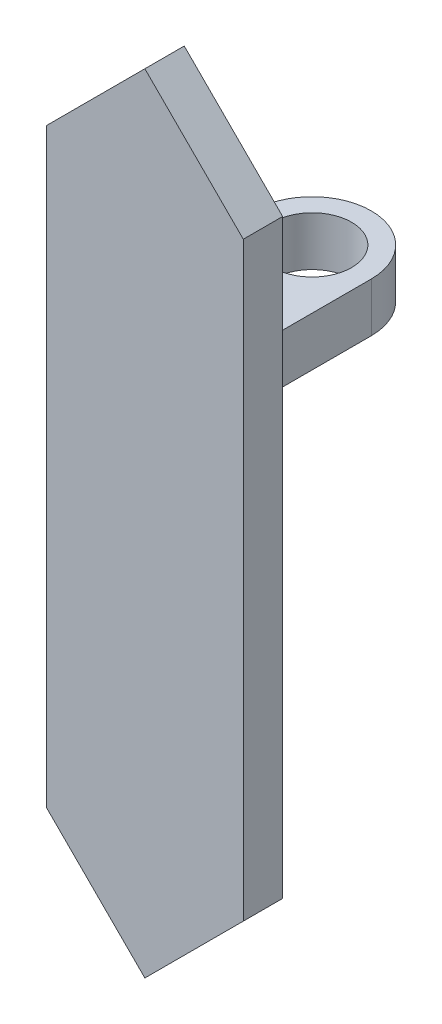
ISO-10303-21;
HEADER;
FILE_DESCRIPTION(('STEP AP214'),'2;1');
FILE_NAME('part.step','',(''),(''),'','','');
FILE_SCHEMA(('AUTOMOTIVE_DESIGN { 1 0 10303 214 1 1 1 1 }'));
ENDSEC;
DATA;
#1=APPLICATION_CONTEXT('core data for automotive mechanical design processes');
#2=APPLICATION_PROTOCOL_DEFINITION('international standard','automotive_design',2000,#1);
#3=PRODUCT_CONTEXT('',#1,'mechanical');
#4=PRODUCT('Part','Part','',(#3));
#5=PRODUCT_RELATED_PRODUCT_CATEGORY('part','',(#4));
#6=PRODUCT_DEFINITION_FORMATION('','',#4);
#7=PRODUCT_DEFINITION_CONTEXT('part definition',#1,'design');
#8=PRODUCT_DEFINITION('design','',#6,#7);
#9=PRODUCT_DEFINITION_SHAPE('','',#8);
#10=(LENGTH_UNIT() NAMED_UNIT(*) SI_UNIT(.MILLI.,.METRE.));
#11=(NAMED_UNIT(*) PLANE_ANGLE_UNIT() SI_UNIT($,.RADIAN.));
#12=(NAMED_UNIT(*) SI_UNIT($,.STERADIAN.) SOLID_ANGLE_UNIT());
#13=UNCERTAINTY_MEASURE_WITH_UNIT(LENGTH_MEASURE(1.E-05),#10,'distance_accuracy_value','');
#14=(GEOMETRIC_REPRESENTATION_CONTEXT(3) GLOBAL_UNCERTAINTY_ASSIGNED_CONTEXT((#13)) GLOBAL_UNIT_ASSIGNED_CONTEXT((#10,
#11,#12)) REPRESENTATION_CONTEXT('',''));
#15=CARTESIAN_POINT('',(0.,0.,0.));
#16=DIRECTION('',(0.,0.,1.));
#17=DIRECTION('',(1.,0.,0.));
#18=AXIS2_PLACEMENT_3D('',#15,#16,#17);
#19=CARTESIAN_POINT('',(4.14728128531616,0.,-20.));
#20=DIRECTION('',(-1.,0.,0.));
#21=DIRECTION('',(0.,0.,1.));
#22=AXIS2_PLACEMENT_3D('',#19,#20,#21);
#23=PLANE('',#22);
#24=DIRECTION('',(0.,0.,1.));
#25=VECTOR('',#24,1.);
#26=CARTESIAN_POINT('',(4.14728128531616,56.,-20.));
#27=LINE('',#26,#25);
#28=CARTESIAN_POINT('',(4.14728128531616,56.,-13.));
#29=VERTEX_POINT('',#28);
#30=CARTESIAN_POINT('',(4.14728128531616,56.,0.));
#31=VERTEX_POINT('',#30);
#32=EDGE_CURVE('E113',#29,#31,#27,.T.);
#33=ORIENTED_EDGE('',*,*,#32,.F.);
#34=DIRECTION('',(0.,-1.,0.));
#35=VECTOR('',#34,1.);
#36=CARTESIAN_POINT('',(4.14728128531616,72.,-13.));
#37=LINE('',#36,#35);
#38=CARTESIAN_POINT('',(4.14728128531616,51.,-13.));
#39=VERTEX_POINT('',#38);
#40=EDGE_CURVE('E168',#29,#39,#37,.T.);
#41=ORIENTED_EDGE('',*,*,#40,.T.);
#42=DIRECTION('',(0.,0.,1.));
#43=VECTOR('',#42,1.);
#44=CARTESIAN_POINT('',(4.14728128531616,51.,-20.));
#45=LINE('',#44,#43);
#46=CARTESIAN_POINT('',(4.14728128531616,51.,0.));
#47=VERTEX_POINT('',#46);
#48=EDGE_CURVE('E175',#39,#47,#45,.T.);
#49=ORIENTED_EDGE('',*,*,#48,.T.);
#50=DIRECTION('',(0.,-1.,0.));
#51=VECTOR('',#50,1.);
#52=CARTESIAN_POINT('',(4.14728128531616,0.,0.));
#53=LINE('',#52,#51);
#54=EDGE_CURVE('E373',#31,#47,#53,.T.);
#55=ORIENTED_EDGE('',*,*,#54,.F.);
#56=EDGE_LOOP('',(#33,#41,#49,#55));
#57=FACE_BOUND('',#56,.T.);
#58=ADVANCED_FACE('F90',(#57),#23,.T.);
#59=CARTESIAN_POINT('',(0.,56.,-20.));
#60=DIRECTION('',(0.,1.,0.));
#61=DIRECTION('',(0.,0.,1.));
#62=AXIS2_PLACEMENT_3D('',#59,#60,#61);
#63=PLANE('',#62);
#64=CARTESIAN_POINT('',(10.1472812853162,56.,-13.));
#65=DIRECTION('',(0.,1.,0.));
#66=DIRECTION('',(0.,0.,1.));
#67=AXIS2_PLACEMENT_3D('',#64,#65,#66);
#68=CIRCLE('',#67,4.);
#69=CARTESIAN_POINT('',(10.1472812853162,56.,-9.));
#70=VERTEX_POINT('',#69);
#71=EDGE_CURVE('E363',#70,#70,#68,.T.);
#72=ORIENTED_EDGE('',*,*,#71,.F.);
#73=EDGE_LOOP('',(#72));
#74=FACE_BOUND('',#73,.T.);
#75=DIRECTION('',(0.,0.,1.));
#76=VECTOR('',#75,1.);
#77=CARTESIAN_POINT('',(16.1472812853161,56.,-20.));
#78=LINE('',#77,#76);
#79=CARTESIAN_POINT('',(16.1472812853161,56.,-13.));
#80=VERTEX_POINT('',#79);
#81=CARTESIAN_POINT('',(16.1472812853161,56.,0.));
#82=VERTEX_POINT('',#81);
#83=EDGE_CURVE('E184',#80,#82,#78,.T.);
#84=ORIENTED_EDGE('',*,*,#83,.F.);
#85=CARTESIAN_POINT('',(10.1472812853162,56.,-13.));
#86=DIRECTION('',(0.,1.,0.));
#87=DIRECTION('',(0.,0.,1.));
#88=AXIS2_PLACEMENT_3D('',#85,#86,#87);
#89=CIRCLE('',#88,6.);
#90=EDGE_CURVE('E368',#80,#29,#89,.T.);
#91=ORIENTED_EDGE('',*,*,#90,.T.);
#92=ORIENTED_EDGE('',*,*,#32,.T.);
#93=DIRECTION('',(-1.,0.,0.));
#94=VECTOR('',#93,1.);
#95=CARTESIAN_POINT('',(0.,56.,0.));
#96=LINE('',#95,#94);
#97=EDGE_CURVE('E375',#82,#31,#96,.T.);
#98=ORIENTED_EDGE('',*,*,#97,.F.);
#99=EDGE_LOOP('',(#84,#91,#92,#98));
#100=FACE_BOUND('',#99,.T.);
#101=ADVANCED_FACE('F277',(#74,#100),#63,.T.);
#102=CARTESIAN_POINT('',(16.1472812853161,0.,-20.));
#103=DIRECTION('',(-1.,0.,0.));
#104=DIRECTION('',(0.,0.,1.));
#105=AXIS2_PLACEMENT_3D('',#102,#103,#104);
#106=PLANE('',#105);
#107=DIRECTION('',(0.,-1.,0.));
#108=VECTOR('',#107,1.);
#109=CARTESIAN_POINT('',(16.1472812853161,72.,-13.));
#110=LINE('',#109,#108);
#111=CARTESIAN_POINT('',(16.1472812853161,51.,-13.));
#112=VERTEX_POINT('',#111);
#113=EDGE_CURVE('E105',#80,#112,#110,.T.);
#114=ORIENTED_EDGE('',*,*,#113,.F.);
#115=ORIENTED_EDGE('',*,*,#83,.T.);
#116=DIRECTION('',(0.,-1.,0.));
#117=VECTOR('',#116,1.);
#118=CARTESIAN_POINT('',(16.1472812853161,0.,0.));
#119=LINE('',#118,#117);
#120=CARTESIAN_POINT('',(16.1472812853161,51.,0.));
#121=VERTEX_POINT('',#120);
#122=EDGE_CURVE('E186',#82,#121,#119,.T.);
#123=ORIENTED_EDGE('',*,*,#122,.T.);
#124=DIRECTION('',(0.,0.,1.));
#125=VECTOR('',#124,1.);
#126=CARTESIAN_POINT('',(16.1472812853161,51.,-20.));
#127=LINE('',#126,#125);
#128=EDGE_CURVE('E182',#112,#121,#127,.T.);
#129=ORIENTED_EDGE('',*,*,#128,.F.);
#130=EDGE_LOOP('',(#114,#115,#123,#129));
#131=FACE_BOUND('',#130,.T.);
#132=ADVANCED_FACE('F270',(#131),#106,.F.);
#133=CARTESIAN_POINT('',(0.,51.,-20.));
#134=DIRECTION('',(0.,1.,0.));
#135=DIRECTION('',(0.,0.,1.));
#136=AXIS2_PLACEMENT_3D('',#133,#134,#135);
#137=PLANE('',#136);
#138=CARTESIAN_POINT('',(10.1472812853162,51.,-13.));
#139=DIRECTION('',(0.,-1.,0.));
#140=DIRECTION('',(0.,0.,-1.));
#141=AXIS2_PLACEMENT_3D('',#138,#139,#140);
#142=CIRCLE('',#141,4.);
#143=CARTESIAN_POINT('',(10.1472812853162,51.,-17.));
#144=VERTEX_POINT('',#143);
#145=EDGE_CURVE('E366',#144,#144,#142,.T.);
#146=ORIENTED_EDGE('',*,*,#145,.F.);
#147=EDGE_LOOP('',(#146));
#148=FACE_BOUND('',#147,.T.);
#149=CARTESIAN_POINT('',(10.1472812853162,51.,-13.));
#150=DIRECTION('',(0.,-1.,0.));
#151=DIRECTION('',(0.,0.,-1.));
#152=AXIS2_PLACEMENT_3D('',#149,#150,#151);
#153=CIRCLE('',#152,6.);
#154=EDGE_CURVE('E165',#39,#112,#153,.T.);
#155=ORIENTED_EDGE('',*,*,#154,.T.);
#156=ORIENTED_EDGE('',*,*,#128,.T.);
#157=DIRECTION('',(-1.,0.,0.));
#158=VECTOR('',#157,1.);
#159=CARTESIAN_POINT('',(0.,51.,0.));
#160=LINE('',#159,#158);
#161=EDGE_CURVE('E181',#121,#47,#160,.T.);
#162=ORIENTED_EDGE('',*,*,#161,.T.);
#163=ORIENTED_EDGE('',*,*,#48,.F.);
#164=EDGE_LOOP('',(#155,#156,#162,#163));
#165=FACE_BOUND('',#164,.T.);
#166=ADVANCED_FACE('F179',(#148,#165),#137,.F.);
#167=CARTESIAN_POINT('',(45.0736406426581,45.0736406426581,4.));
#168=DIRECTION('',(0.707106781186548,0.707106781186547,0.));
#169=DIRECTION('',(-0.707106781186547,0.707106781186548,0.));
#170=AXIS2_PLACEMENT_3D('',#167,#168,#169);
#171=PLANE('',#170);
#172=DIRECTION('',(0.707106781186547,-0.707106781186548,0.));
#173=VECTOR('',#172,1.);
#174=CARTESIAN_POINT('',(45.0736406426581,45.0736406426581,0.));
#175=LINE('',#174,#173);
#176=CARTESIAN_POINT('',(10.1472812853162,80.,0.));
#177=VERTEX_POINT('',#176);
#178=CARTESIAN_POINT('',(20.1472812853162,70.,0.));
#179=VERTEX_POINT('',#178);
#180=EDGE_CURVE('E219',#177,#179,#175,.T.);
#181=ORIENTED_EDGE('',*,*,#180,.F.);
#182=DIRECTION('',(0.,0.,-1.));
#183=VECTOR('',#182,1.);
#184=CARTESIAN_POINT('',(10.1472812853162,80.,4.));
#185=LINE('',#184,#183);
#186=CARTESIAN_POINT('',(10.1472812853162,80.,4.));
#187=VERTEX_POINT('',#186);
#188=EDGE_CURVE('E225',#187,#177,#185,.T.);
#189=ORIENTED_EDGE('',*,*,#188,.F.);
#190=DIRECTION('',(0.707106781186547,-0.707106781186548,0.));
#191=VECTOR('',#190,1.);
#192=CARTESIAN_POINT('',(45.0736406426581,45.0736406426581,4.));
#193=LINE('',#192,#191);
#194=CARTESIAN_POINT('',(20.1472812853162,70.,4.));
#195=VERTEX_POINT('',#194);
#196=EDGE_CURVE('E203',#187,#195,#193,.T.);
#197=ORIENTED_EDGE('',*,*,#196,.T.);
#198=DIRECTION('',(0.,0.,-1.));
#199=VECTOR('',#198,1.);
#200=CARTESIAN_POINT('',(20.1472812853162,70.,4.));
#201=LINE('',#200,#199);
#202=EDGE_CURVE('E227',#195,#179,#201,.T.);
#203=ORIENTED_EDGE('',*,*,#202,.T.);
#204=EDGE_LOOP('',(#181,#189,#197,#203));
#205=FACE_BOUND('',#204,.T.);
#206=ADVANCED_FACE('F261',(#205),#171,.T.);
#207=CARTESIAN_POINT('',(0.,0.,0.));
#208=DIRECTION('',(0.,0.,1.));
#209=DIRECTION('',(1.,0.,0.));
#210=AXIS2_PLACEMENT_3D('',#207,#208,#209);
#211=PLANE('',#210);
#212=ORIENTED_EDGE('',*,*,#97,.T.);
#213=ORIENTED_EDGE('',*,*,#54,.T.);
#214=ORIENTED_EDGE('',*,*,#161,.F.);
#215=ORIENTED_EDGE('',*,*,#122,.F.);
#216=EDGE_LOOP('',(#212,#213,#214,#215));
#217=FACE_BOUND('',#216,.T.);
#218=DIRECTION('',(0.,1.,0.));
#219=VECTOR('',#218,1.);
#220=CARTESIAN_POINT('',(0.147281285316174,0.,0.));
#221=LINE('',#220,#219);
#222=CARTESIAN_POINT('',(0.147281285316174,9.99999999999999,0.));
#223=VERTEX_POINT('',#222);
#224=CARTESIAN_POINT('',(0.147281285316174,70.,0.));
#225=VERTEX_POINT('',#224);
#226=EDGE_CURVE('E192',#223,#225,#221,.T.);
#227=ORIENTED_EDGE('',*,*,#226,.T.);
#228=DIRECTION('',(0.707106781186548,0.707106781186548,0.));
#229=VECTOR('',#228,1.);
#230=CARTESIAN_POINT('',(-34.9263593573419,34.9263593573419,0.));
#231=LINE('',#230,#229);
#232=EDGE_CURVE('E197',#225,#177,#231,.T.);
#233=ORIENTED_EDGE('',*,*,#232,.T.);
#234=ORIENTED_EDGE('',*,*,#180,.T.);
#235=DIRECTION('',(0.,1.,0.));
#236=VECTOR('',#235,1.);
#237=CARTESIAN_POINT('',(20.1472812853162,0.,0.));
#238=LINE('',#237,#236);
#239=CARTESIAN_POINT('',(20.1472812853162,10.,0.));
#240=VERTEX_POINT('',#239);
#241=EDGE_CURVE('E216',#240,#179,#238,.T.);
#242=ORIENTED_EDGE('',*,*,#241,.F.);
#243=DIRECTION('',(0.707106781186548,0.707106781186548,0.));
#244=VECTOR('',#243,1.);
#245=CARTESIAN_POINT('',(5.07364064265808,-5.07364064265808,0.));
#246=LINE('',#245,#244);
#247=CARTESIAN_POINT('',(10.1472812853162,0.,0.));
#248=VERTEX_POINT('',#247);
#249=EDGE_CURVE('E214',#248,#240,#246,.T.);
#250=ORIENTED_EDGE('',*,*,#249,.F.);
#251=DIRECTION('',(0.707106781186548,-0.707106781186548,0.));
#252=VECTOR('',#251,1.);
#253=CARTESIAN_POINT('',(5.07364064265808,5.07364064265808,0.));
#254=LINE('',#253,#252);
#255=EDGE_CURVE('E212',#223,#248,#254,.T.);
#256=ORIENTED_EDGE('',*,*,#255,.F.);
#257=EDGE_LOOP('',(#227,#233,#234,#242,#250,#256));
#258=FACE_BOUND('',#257,.T.);
#259=ADVANCED_FACE('F243',(#217,#258),#211,.F.);
#260=CARTESIAN_POINT('',(20.1472812853162,0.,4.));
#261=DIRECTION('',(-1.,0.,0.));
#262=DIRECTION('',(0.,0.,1.));
#263=AXIS2_PLACEMENT_3D('',#260,#261,#262);
#264=PLANE('',#263);
#265=ORIENTED_EDGE('',*,*,#241,.T.);
#266=ORIENTED_EDGE('',*,*,#202,.F.);
#267=DIRECTION('',(0.,1.,0.));
#268=VECTOR('',#267,1.);
#269=CARTESIAN_POINT('',(20.1472812853162,0.,4.));
#270=LINE('',#269,#268);
#271=CARTESIAN_POINT('',(20.1472812853162,10.,4.));
#272=VERTEX_POINT('',#271);
#273=EDGE_CURVE('E201',#272,#195,#270,.T.);
#274=ORIENTED_EDGE('',*,*,#273,.F.);
#275=DIRECTION('',(0.,0.,-1.));
#276=VECTOR('',#275,1.);
#277=CARTESIAN_POINT('',(20.1472812853162,10.,4.));
#278=LINE('',#277,#276);
#279=EDGE_CURVE('E229',#272,#240,#278,.T.);
#280=ORIENTED_EDGE('',*,*,#279,.T.);
#281=EDGE_LOOP('',(#265,#266,#274,#280));
#282=FACE_BOUND('',#281,.T.);
#283=ADVANCED_FACE('F248',(#282),#264,.F.);
#284=CARTESIAN_POINT('',(5.07364064265808,-5.07364064265808,4.));
#285=DIRECTION('',(-0.707106781186547,0.707106781186547,0.));
#286=DIRECTION('',(-0.707106781186548,-0.707106781186548,0.));
#287=AXIS2_PLACEMENT_3D('',#284,#285,#286);
#288=PLANE('',#287);
#289=ORIENTED_EDGE('',*,*,#249,.T.);
#290=ORIENTED_EDGE('',*,*,#279,.F.);
#291=DIRECTION('',(0.707106781186548,0.707106781186548,0.));
#292=VECTOR('',#291,1.);
#293=CARTESIAN_POINT('',(5.07364064265808,-5.07364064265808,4.));
#294=LINE('',#293,#292);
#295=CARTESIAN_POINT('',(10.1472812853162,0.,4.));
#296=VERTEX_POINT('',#295);
#297=EDGE_CURVE('E199',#296,#272,#294,.T.);
#298=ORIENTED_EDGE('',*,*,#297,.F.);
#299=DIRECTION('',(0.,0.,-1.));
#300=VECTOR('',#299,1.);
#301=CARTESIAN_POINT('',(10.1472812853162,0.,4.));
#302=LINE('',#301,#300);
#303=EDGE_CURVE('E98',#296,#248,#302,.T.);
#304=ORIENTED_EDGE('',*,*,#303,.T.);
#305=EDGE_LOOP('',(#289,#290,#298,#304));
#306=FACE_BOUND('',#305,.T.);
#307=ADVANCED_FACE('F236',(#306),#288,.F.);
#308=CARTESIAN_POINT('',(5.07364064265808,5.07364064265808,4.));
#309=DIRECTION('',(0.707106781186547,0.707106781186547,0.));
#310=DIRECTION('',(-0.707106781186548,0.707106781186548,0.));
#311=AXIS2_PLACEMENT_3D('',#308,#309,#310);
#312=PLANE('',#311);
#313=ORIENTED_EDGE('',*,*,#255,.T.);
#314=ORIENTED_EDGE('',*,*,#303,.F.);
#315=DIRECTION('',(0.707106781186548,-0.707106781186548,0.));
#316=VECTOR('',#315,1.);
#317=CARTESIAN_POINT('',(5.07364064265808,5.07364064265808,4.));
#318=LINE('',#317,#316);
#319=CARTESIAN_POINT('',(0.147281285316174,9.99999999999999,4.));
#320=VERTEX_POINT('',#319);
#321=EDGE_CURVE('E196',#320,#296,#318,.T.);
#322=ORIENTED_EDGE('',*,*,#321,.F.);
#323=DIRECTION('',(0.,0.,-1.));
#324=VECTOR('',#323,1.);
#325=CARTESIAN_POINT('',(0.147281285316174,9.99999999999999,4.));
#326=LINE('',#325,#324);
#327=EDGE_CURVE('E12',#320,#223,#326,.T.);
#328=ORIENTED_EDGE('',*,*,#327,.T.);
#329=EDGE_LOOP('',(#313,#314,#322,#328));
#330=FACE_BOUND('',#329,.T.);
#331=ADVANCED_FACE('F255',(#330),#312,.F.);
#332=CARTESIAN_POINT('',(0.147281285316174,0.,4.));
#333=DIRECTION('',(-1.,0.,0.));
#334=DIRECTION('',(0.,0.,1.));
#335=AXIS2_PLACEMENT_3D('',#332,#333,#334);
#336=PLANE('',#335);
#337=ORIENTED_EDGE('',*,*,#226,.F.);
#338=ORIENTED_EDGE('',*,*,#327,.F.);
#339=DIRECTION('',(0.,1.,0.));
#340=VECTOR('',#339,1.);
#341=CARTESIAN_POINT('',(0.147281285316174,0.,4.));
#342=LINE('',#341,#340);
#343=CARTESIAN_POINT('',(0.147281285316174,70.,4.));
#344=VERTEX_POINT('',#343);
#345=EDGE_CURVE('E193',#320,#344,#342,.T.);
#346=ORIENTED_EDGE('',*,*,#345,.T.);
#347=DIRECTION('',(0.,0.,-1.));
#348=VECTOR('',#347,1.);
#349=CARTESIAN_POINT('',(0.147281285316174,70.,4.));
#350=LINE('',#349,#348);
#351=EDGE_CURVE('E209',#344,#225,#350,.T.);
#352=ORIENTED_EDGE('',*,*,#351,.T.);
#353=EDGE_LOOP('',(#337,#338,#346,#352));
#354=FACE_BOUND('',#353,.T.);
#355=ADVANCED_FACE('F92',(#354),#336,.T.);
#356=CARTESIAN_POINT('',(-34.9263593573419,34.9263593573419,4.));
#357=DIRECTION('',(-0.707106781186547,0.707106781186547,0.));
#358=DIRECTION('',(-0.707106781186548,-0.707106781186548,0.));
#359=AXIS2_PLACEMENT_3D('',#356,#357,#358);
#360=PLANE('',#359);
#361=ORIENTED_EDGE('',*,*,#232,.F.);
#362=ORIENTED_EDGE('',*,*,#351,.F.);
#363=DIRECTION('',(0.707106781186548,0.707106781186548,0.));
#364=VECTOR('',#363,1.);
#365=CARTESIAN_POINT('',(-34.9263593573419,34.9263593573419,4.));
#366=LINE('',#365,#364);
#367=EDGE_CURVE('E206',#344,#187,#366,.T.);
#368=ORIENTED_EDGE('',*,*,#367,.T.);
#369=ORIENTED_EDGE('',*,*,#188,.T.);
#370=EDGE_LOOP('',(#361,#362,#368,#369));
#371=FACE_BOUND('',#370,.T.);
#372=ADVANCED_FACE('F259',(#371),#360,.T.);
#373=CARTESIAN_POINT('',(0.,0.,4.));
#374=DIRECTION('',(0.,0.,1.));
#375=DIRECTION('',(1.,0.,0.));
#376=AXIS2_PLACEMENT_3D('',#373,#374,#375);
#377=PLANE('',#376);
#378=ORIENTED_EDGE('',*,*,#345,.F.);
#379=ORIENTED_EDGE('',*,*,#321,.T.);
#380=ORIENTED_EDGE('',*,*,#297,.T.);
#381=ORIENTED_EDGE('',*,*,#273,.T.);
#382=ORIENTED_EDGE('',*,*,#196,.F.);
#383=ORIENTED_EDGE('',*,*,#367,.F.);
#384=EDGE_LOOP('',(#378,#379,#380,#381,#382,#383));
#385=FACE_BOUND('',#384,.T.);
#386=ADVANCED_FACE('F253',(#385),#377,.T.);
#387=CARTESIAN_POINT('',(10.1472812853162,72.,-13.));
#388=DIRECTION('',(0.,-1.,0.));
#389=DIRECTION('',(0.,0.,-1.));
#390=AXIS2_PLACEMENT_3D('',#387,#388,#389);
#391=CYLINDRICAL_SURFACE('',#390,4.);
#392=ORIENTED_EDGE('',*,*,#71,.T.);
#393=EDGE_LOOP('',(#392));
#394=FACE_BOUND('',#393,.T.);
#395=ORIENTED_EDGE('',*,*,#145,.T.);
#396=EDGE_LOOP('',(#395));
#397=FACE_BOUND('',#396,.T.);
#398=ADVANCED_FACE('F287',(#394,#397),#391,.F.);
#399=CARTESIAN_POINT('',(10.1472812853162,72.,-13.));
#400=DIRECTION('',(0.,-1.,0.));
#401=DIRECTION('',(0.,0.,-1.));
#402=AXIS2_PLACEMENT_3D('',#399,#400,#401);
#403=CYLINDRICAL_SURFACE('',#402,6.);
#404=ORIENTED_EDGE('',*,*,#113,.T.);
#405=ORIENTED_EDGE('',*,*,#154,.F.);
#406=ORIENTED_EDGE('',*,*,#40,.F.);
#407=ORIENTED_EDGE('',*,*,#90,.F.);
#408=EDGE_LOOP('',(#404,#405,#406,#407));
#409=FACE_BOUND('',#408,.T.);
#410=ADVANCED_FACE('F167',(#409),#403,.T.);
#411=CLOSED_SHELL('',(#58,#101,#132,#166,#206,#259,#283,#307,#331,#355,#372,#386,#398,#410));
#412=MANIFOLD_SOLID_BREP('B2',#411);
#413=ADVANCED_BREP_SHAPE_REPRESENTATION('',(#18,#412),#14);
#414=SHAPE_DEFINITION_REPRESENTATION(#9,#413);
ENDSEC;
END-ISO-10303-21;
